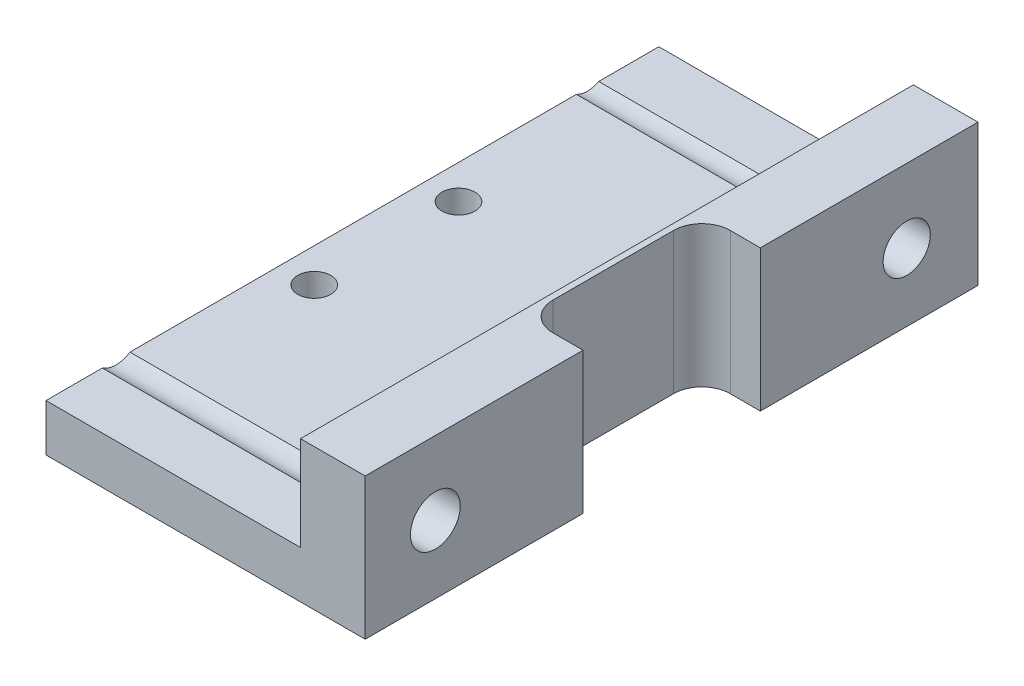
ISO-10303-21;
HEADER;
FILE_DESCRIPTION(('STEP AP214'),'2;1');
FILE_NAME('part.step','',(''),(''),'','','');
FILE_SCHEMA(('AUTOMOTIVE_DESIGN { 1 0 10303 214 1 1 1 1 }'));
ENDSEC;
DATA;
#1=APPLICATION_CONTEXT('core data for automotive mechanical design processes');
#2=APPLICATION_PROTOCOL_DEFINITION('international standard','automotive_design',2000,#1);
#3=PRODUCT_CONTEXT('',#1,'mechanical');
#4=PRODUCT('Part','Part','',(#3));
#5=PRODUCT_RELATED_PRODUCT_CATEGORY('part','',(#4));
#6=PRODUCT_DEFINITION_FORMATION('','',#4);
#7=PRODUCT_DEFINITION_CONTEXT('part definition',#1,'design');
#8=PRODUCT_DEFINITION('design','',#6,#7);
#9=PRODUCT_DEFINITION_SHAPE('','',#8);
#10=(LENGTH_UNIT() NAMED_UNIT(*) SI_UNIT(.MILLI.,.METRE.));
#11=(NAMED_UNIT(*) PLANE_ANGLE_UNIT() SI_UNIT($,.RADIAN.));
#12=(NAMED_UNIT(*) SI_UNIT($,.STERADIAN.) SOLID_ANGLE_UNIT());
#13=UNCERTAINTY_MEASURE_WITH_UNIT(LENGTH_MEASURE(1.E-05),#10,'distance_accuracy_value','');
#14=(GEOMETRIC_REPRESENTATION_CONTEXT(3) GLOBAL_UNCERTAINTY_ASSIGNED_CONTEXT((#13)) GLOBAL_UNIT_ASSIGNED_CONTEXT((#10,
#11,#12)) REPRESENTATION_CONTEXT('',''));
#15=CARTESIAN_POINT('',(0.,0.,0.));
#16=DIRECTION('',(0.,0.,1.));
#17=DIRECTION('',(1.,0.,0.));
#18=AXIS2_PLACEMENT_3D('',#15,#16,#17);
#19=CARTESIAN_POINT('',(-23.1830505076395,5.,70.8669471874579));
#20=DIRECTION('',(0.,-1.,0.));
#21=DIRECTION('',(1.,0.,0.));
#22=AXIS2_PLACEMENT_3D('',#19,#20,#21);
#23=PLANE('',#22);
#24=DIRECTION('',(0.,0.,-1.));
#25=VECTOR('',#24,1.);
#26=CARTESIAN_POINT('',(-23.1830505076395,5.,70.8669471874579));
#27=LINE('',#26,#25);
#28=CARTESIAN_POINT('',(-23.1830505076395,5.,-25.758291516465));
#29=VERTEX_POINT('',#28);
#30=CARTESIAN_POINT('',(-23.1830505076395,5.,-32.1330528125422));
#31=VERTEX_POINT('',#30);
#32=EDGE_CURVE('E165',#29,#31,#27,.T.);
#33=ORIENTED_EDGE('',*,*,#32,.F.);
#34=DIRECTION('',(1.,0.,0.));
#35=VECTOR('',#34,1.);
#36=CARTESIAN_POINT('',(-23.3275172926783,5.,-25.758291516465));
#37=LINE('',#36,#35);
#38=CARTESIAN_POINT('',(3.8169494923605,5.,-25.758291516465));
#39=VERTEX_POINT('',#38);
#40=EDGE_CURVE('E282',#29,#39,#37,.T.);
#41=ORIENTED_EDGE('',*,*,#40,.T.);
#42=DIRECTION('',(0.,0.,-1.));
#43=VECTOR('',#42,1.);
#44=CARTESIAN_POINT('',(3.8169494923605,5.,70.8669471874579));
#45=LINE('',#44,#43);
#46=CARTESIAN_POINT('',(3.8169494923605,5.,-32.1330528125422));
#47=VERTEX_POINT('',#46);
#48=EDGE_CURVE('E163',#39,#47,#45,.T.);
#49=ORIENTED_EDGE('',*,*,#48,.T.);
#50=DIRECTION('',(-1.,0.,0.));
#51=VECTOR('',#50,1.);
#52=CARTESIAN_POINT('',(-23.1830505076395,5.,-32.1330528125422));
#53=LINE('',#52,#51);
#54=EDGE_CURVE('E166',#47,#31,#53,.T.);
#55=ORIENTED_EDGE('',*,*,#54,.T.);
#56=EDGE_LOOP('',(#33,#41,#49,#55));
#57=FACE_BOUND('',#56,.T.);
#58=ADVANCED_FACE('F33',(#57),#23,.F.);
#59=CARTESIAN_POINT('',(0.416949492360503,4.99999999999999,-7.28240635641317));
#60=DIRECTION('',(0.,-1.,0.));
#61=DIRECTION('',(1.,0.,0.));
#62=AXIS2_PLACEMENT_3D('',#59,#60,#61);
#63=CIRCLE('',#62,1.75);
#64=CARTESIAN_POINT('',(2.1669494923605,4.99999999999999,-7.28240635641317));
#65=VERTEX_POINT('',#64);
#66=EDGE_CURVE('E257',#65,#65,#63,.T.);
#67=ORIENTED_EDGE('',*,*,#66,.T.);
#68=EDGE_LOOP('',(#67));
#69=FACE_BOUND('',#68,.T.);
#70=CARTESIAN_POINT('',(-19.5830505076395,5.,8.01759364358684));
#71=DIRECTION('',(0.,-1.,0.));
#72=DIRECTION('',(1.,0.,0.));
#73=AXIS2_PLACEMENT_3D('',#70,#71,#72);
#74=CIRCLE('',#73,1.75);
#75=CARTESIAN_POINT('',(-17.8330505076395,5.,8.01759364358684));
#76=VERTEX_POINT('',#75);
#77=EDGE_CURVE('E254',#76,#76,#74,.F.);
#78=ORIENTED_EDGE('',*,*,#77,.F.);
#79=EDGE_LOOP('',(#78));
#80=FACE_BOUND('',#79,.T.);
#81=CARTESIAN_POINT('',(0.416949492360503,4.99999999999999,8.01759364358684));
#82=DIRECTION('',(0.,-1.,0.));
#83=DIRECTION('',(1.,0.,0.));
#84=AXIS2_PLACEMENT_3D('',#81,#82,#83);
#85=CIRCLE('',#84,1.75);
#86=CARTESIAN_POINT('',(2.1669494923605,4.99999999999999,8.01759364358684));
#87=VERTEX_POINT('',#86);
#88=EDGE_CURVE('E247',#87,#87,#85,.F.);
#89=ORIENTED_EDGE('',*,*,#88,.F.);
#90=EDGE_LOOP('',(#89));
#91=FACE_BOUND('',#90,.T.);
#92=CARTESIAN_POINT('',(-19.5830505076395,5.,-7.28240635641317));
#93=DIRECTION('',(0.,-1.,0.));
#94=DIRECTION('',(1.,0.,0.));
#95=AXIS2_PLACEMENT_3D('',#92,#93,#94);
#96=CIRCLE('',#95,1.75);
#97=CARTESIAN_POINT('',(-17.8330505076395,5.,-7.28240635641317));
#98=VERTEX_POINT('',#97);
#99=EDGE_CURVE('E250',#98,#98,#96,.T.);
#100=ORIENTED_EDGE('',*,*,#99,.T.);
#101=EDGE_LOOP('',(#100));
#102=FACE_BOUND('',#101,.T.);
#103=CARTESIAN_POINT('',(3.8169494923605,5.,23.9626303840473));
#104=VERTEX_POINT('',#103);
#105=CARTESIAN_POINT('',(3.8169494923605,5.,-23.3896578850426));
#106=VERTEX_POINT('',#105);
#107=EDGE_CURVE('E155',#104,#106,#45,.T.);
#108=ORIENTED_EDGE('',*,*,#107,.T.);
#109=DIRECTION('',(1.,0.,0.));
#110=VECTOR('',#109,1.);
#111=CARTESIAN_POINT('',(-23.3275172926783,5.,-23.3896578850426));
#112=LINE('',#111,#110);
#113=CARTESIAN_POINT('',(-23.1830505076395,5.,-23.3896578850426));
#114=VERTEX_POINT('',#113);
#115=EDGE_CURVE('E48',#106,#114,#112,.F.);
#116=ORIENTED_EDGE('',*,*,#115,.T.);
#117=CARTESIAN_POINT('',(-23.1830505076395,5.,23.9626303840473));
#118=VERTEX_POINT('',#117);
#119=EDGE_CURVE('E157',#118,#114,#27,.T.);
#120=ORIENTED_EDGE('',*,*,#119,.F.);
#121=DIRECTION('',(1.,0.,0.));
#122=VECTOR('',#121,1.);
#123=CARTESIAN_POINT('',(-23.3275172926783,5.,23.9626303840473));
#124=LINE('',#123,#122);
#125=EDGE_CURVE('E144',#118,#104,#124,.T.);
#126=ORIENTED_EDGE('',*,*,#125,.T.);
#127=EDGE_LOOP('',(#108,#116,#120,#126));
#128=FACE_BOUND('',#127,.T.);
#129=ADVANCED_FACE('F154',(#69,#80,#91,#102,#128),#23,.F.);
#130=CARTESIAN_POINT('',(7.47247735887404,0.,6.76207757796048));
#131=DIRECTION('',(0.,1.,0.));
#132=DIRECTION('',(0.,0.,1.));
#133=AXIS2_PLACEMENT_3D('',#130,#131,#132);
#134=PLANE('',#133);
#135=CARTESIAN_POINT('',(-19.5830505076395,0.,-7.28240635641317));
#136=DIRECTION('',(0.,-1.,0.));
#137=DIRECTION('',(0.,0.,-1.));
#138=AXIS2_PLACEMENT_3D('',#135,#136,#137);
#139=CIRCLE('',#138,1.75);
#140=CARTESIAN_POINT('',(-19.5830505076395,0.,-9.03240635641317));
#141=VERTEX_POINT('',#140);
#142=EDGE_CURVE('E274',#141,#141,#139,.T.);
#143=ORIENTED_EDGE('',*,*,#142,.F.);
#144=EDGE_LOOP('',(#143));
#145=FACE_BOUND('',#144,.T.);
#146=CARTESIAN_POINT('',(0.416949492360503,0.,8.01759364358684));
#147=DIRECTION('',(0.,1.,0.));
#148=DIRECTION('',(0.,0.,1.));
#149=AXIS2_PLACEMENT_3D('',#146,#147,#148);
#150=CIRCLE('',#149,1.75);
#151=CARTESIAN_POINT('',(0.416949492360503,0.,9.76759364358684));
#152=VERTEX_POINT('',#151);
#153=EDGE_CURVE('E251',#152,#152,#150,.T.);
#154=ORIENTED_EDGE('',*,*,#153,.T.);
#155=EDGE_LOOP('',(#154));
#156=FACE_BOUND('',#155,.T.);
#157=DIRECTION('',(0.,0.,1.));
#158=VECTOR('',#157,1.);
#159=CARTESIAN_POINT('',(-23.1830505076395,0.,-32.1330528125422));
#160=LINE('',#159,#158);
#161=CARTESIAN_POINT('',(-23.1830505076395,0.,-32.1330528125422));
#162=VERTEX_POINT('',#161);
#163=CARTESIAN_POINT('',(-23.1830505076395,0.,32.8682400997158));
#164=VERTEX_POINT('',#163);
#165=EDGE_CURVE('E177',#162,#164,#160,.T.);
#166=ORIENTED_EDGE('',*,*,#165,.F.);
#167=DIRECTION('',(-1.,0.,0.));
#168=VECTOR('',#167,1.);
#169=CARTESIAN_POINT('',(-23.1830505076395,0.,-32.1330528125422));
#170=LINE('',#169,#168);
#171=CARTESIAN_POINT('',(10.6724827073217,0.,-32.1330528125422));
#172=VERTEX_POINT('',#171);
#173=EDGE_CURVE('E181',#172,#162,#170,.T.);
#174=ORIENTED_EDGE('',*,*,#173,.F.);
#175=DIRECTION('',(0.,0.,-1.));
#176=VECTOR('',#175,1.);
#177=CARTESIAN_POINT('',(10.6724827073217,0.,-32.1330528125422));
#178=LINE('',#177,#176);
#179=CARTESIAN_POINT('',(10.6724827073217,0.,-9.04017307756061));
#180=VERTEX_POINT('',#179);
#181=EDGE_CURVE('E215',#180,#172,#178,.T.);
#182=ORIENTED_EDGE('',*,*,#181,.F.);
#183=DIRECTION('',(0.999994771631635,0.,0.00323368356438442));
#184=VECTOR('',#183,1.);
#185=CARTESIAN_POINT('',(7.48217840956719,0.,-9.05048956607205));
#186=LINE('',#185,#184);
#187=CARTESIAN_POINT('',(7.48217840956719,0.,-9.05048956607205));
#188=VERTEX_POINT('',#187);
#189=EDGE_CURVE('E213',#188,#180,#186,.T.);
#190=ORIENTED_EDGE('',*,*,#189,.F.);
#191=CARTESIAN_POINT('',(7.47247735887404,0.,-6.05050525117714));
#192=DIRECTION('',(0.,-1.,0.));
#193=DIRECTION('',(0.,0.,1.));
#194=AXIS2_PLACEMENT_3D('',#191,#192,#193);
#195=CIRCLE('',#194,3.);
#196=CARTESIAN_POINT('',(4.47247735887403,0.,-6.05050525117714));
#197=VERTEX_POINT('',#196);
#198=EDGE_CURVE('E211',#197,#188,#195,.T.);
#199=ORIENTED_EDGE('',*,*,#198,.F.);
#200=DIRECTION('',(0.,0.,-1.));
#201=VECTOR('',#200,1.);
#202=CARTESIAN_POINT('',(4.47247735887404,0.,6.76207757796048));
#203=LINE('',#202,#201);
#204=CARTESIAN_POINT('',(4.47247735887404,0.,6.76207757796048));
#205=VERTEX_POINT('',#204);
#206=EDGE_CURVE('E209',#205,#197,#203,.T.);
#207=ORIENTED_EDGE('',*,*,#206,.F.);
#208=CARTESIAN_POINT('',(7.47247735887404,0.,6.76207757796048));
#209=DIRECTION('',(0.,-1.,0.));
#210=DIRECTION('',(0.,0.,1.));
#211=AXIS2_PLACEMENT_3D('',#208,#209,#210);
#212=CIRCLE('',#211,3.);
#213=CARTESIAN_POINT('',(7.47247735887404,0.,9.76207757796048));
#214=VERTEX_POINT('',#213);
#215=EDGE_CURVE('E207',#214,#205,#212,.T.);
#216=ORIENTED_EDGE('',*,*,#215,.F.);
#217=DIRECTION('',(-1.,0.,0.));
#218=VECTOR('',#217,1.);
#219=CARTESIAN_POINT('',(10.6724827073217,0.,9.76207757796047));
#220=LINE('',#219,#218);
#221=CARTESIAN_POINT('',(10.6724827073217,0.,9.76207757796047));
#222=VERTEX_POINT('',#221);
#223=EDGE_CURVE('E205',#222,#214,#220,.T.);
#224=ORIENTED_EDGE('',*,*,#223,.F.);
#225=DIRECTION('',(0.,0.,-1.));
#226=VECTOR('',#225,1.);
#227=CARTESIAN_POINT('',(10.6724827073217,0.,9.76207757796047));
#228=LINE('',#227,#226);
#229=CARTESIAN_POINT('',(10.6724827073217,0.,32.8682400997158));
#230=VERTEX_POINT('',#229);
#231=EDGE_CURVE('E203',#230,#222,#228,.T.);
#232=ORIENTED_EDGE('',*,*,#231,.F.);
#233=DIRECTION('',(1.,0.,0.));
#234=VECTOR('',#233,1.);
#235=CARTESIAN_POINT('',(-23.1830505076395,0.,32.8682400997158));
#236=LINE('',#235,#234);
#237=EDGE_CURVE('E201',#164,#230,#236,.T.);
#238=ORIENTED_EDGE('',*,*,#237,.F.);
#239=EDGE_LOOP('',(#166,#174,#182,#190,#199,#207,#216,#224,#232,#238));
#240=FACE_BOUND('',#239,.T.);
#241=CARTESIAN_POINT('',(-19.5830505076395,0.,8.01759364358684));
#242=DIRECTION('',(0.,1.,0.));
#243=DIRECTION('',(0.,0.,1.));
#244=AXIS2_PLACEMENT_3D('',#241,#242,#243);
#245=CIRCLE('',#244,1.75);
#246=CARTESIAN_POINT('',(-19.5830505076395,0.,9.76759364358684));
#247=VERTEX_POINT('',#246);
#248=EDGE_CURVE('E271',#247,#247,#245,.T.);
#249=ORIENTED_EDGE('',*,*,#248,.T.);
#250=EDGE_LOOP('',(#249));
#251=FACE_BOUND('',#250,.T.);
#252=CARTESIAN_POINT('',(0.416949492360503,0.,-7.28240635641317));
#253=DIRECTION('',(0.,-1.,0.));
#254=DIRECTION('',(0.,0.,-1.));
#255=AXIS2_PLACEMENT_3D('',#252,#253,#254);
#256=CIRCLE('',#255,1.75);
#257=CARTESIAN_POINT('',(0.416949492360503,0.,-9.03240635641317));
#258=VERTEX_POINT('',#257);
#259=EDGE_CURVE('E270',#258,#258,#256,.T.);
#260=ORIENTED_EDGE('',*,*,#259,.F.);
#261=EDGE_LOOP('',(#260));
#262=FACE_BOUND('',#261,.T.);
#263=ADVANCED_FACE('F314',(#145,#156,#240,#251,#262),#134,.F.);
#264=CARTESIAN_POINT('',(3.8169494923605,5.,32.8682400997158));
#265=VERTEX_POINT('',#264);
#266=CARTESIAN_POINT('',(3.8169494923605,5.,26.8894202144451));
#267=VERTEX_POINT('',#266);
#268=EDGE_CURVE('E162',#265,#267,#45,.T.);
#269=ORIENTED_EDGE('',*,*,#268,.T.);
#270=DIRECTION('',(1.,0.,0.));
#271=VECTOR('',#270,1.);
#272=CARTESIAN_POINT('',(-23.3275172926783,5.,26.8894202144451));
#273=LINE('',#272,#271);
#274=CARTESIAN_POINT('',(-23.1830505076395,5.,26.8894202144451));
#275=VERTEX_POINT('',#274);
#276=EDGE_CURVE('E55',#267,#275,#273,.F.);
#277=ORIENTED_EDGE('',*,*,#276,.T.);
#278=CARTESIAN_POINT('',(-23.1830505076395,5.,32.8682400997158));
#279=VERTEX_POINT('',#278);
#280=EDGE_CURVE('E169',#279,#275,#27,.T.);
#281=ORIENTED_EDGE('',*,*,#280,.F.);
#282=DIRECTION('',(-1.,0.,0.));
#283=VECTOR('',#282,1.);
#284=CARTESIAN_POINT('',(-23.1830505076395,5.,32.8682400997158));
#285=LINE('',#284,#283);
#286=EDGE_CURVE('E174',#265,#279,#285,.T.);
#287=ORIENTED_EDGE('',*,*,#286,.F.);
#288=EDGE_LOOP('',(#269,#277,#281,#287));
#289=FACE_BOUND('',#288,.T.);
#290=ADVANCED_FACE('F324',(#289),#23,.F.);
#291=CARTESIAN_POINT('',(-23.1830505076395,15.,-32.1330528125422));
#292=DIRECTION('',(1.,0.,0.));
#293=DIRECTION('',(0.,0.,-1.));
#294=AXIS2_PLACEMENT_3D('',#291,#292,#293);
#295=PLANE('',#294);
#296=ORIENTED_EDGE('',*,*,#119,.T.);
#297=CARTESIAN_POINT('',(-23.1830505076395,7.20167974056713,-24.5739747007538));
#298=DIRECTION('',(1.,0.,0.));
#299=DIRECTION('',(0.,0.,-1.));
#300=AXIS2_PLACEMENT_3D('',#297,#298,#299);
#301=CIRCLE('',#300,2.5);
#302=EDGE_CURVE('E279',#114,#29,#301,.T.);
#303=ORIENTED_EDGE('',*,*,#302,.T.);
#304=ORIENTED_EDGE('',*,*,#32,.T.);
#305=DIRECTION('',(0.,-1.,0.));
#306=VECTOR('',#305,1.);
#307=CARTESIAN_POINT('',(-23.1830505076395,15.,-32.1330528125422));
#308=LINE('',#307,#306);
#309=EDGE_CURVE('E198',#31,#162,#308,.T.);
#310=ORIENTED_EDGE('',*,*,#309,.T.);
#311=ORIENTED_EDGE('',*,*,#165,.T.);
#312=DIRECTION('',(0.,-1.,0.));
#313=VECTOR('',#312,1.);
#314=CARTESIAN_POINT('',(-23.1830505076395,15.,32.8682400997158));
#315=LINE('',#314,#313);
#316=EDGE_CURVE('E244',#279,#164,#315,.T.);
#317=ORIENTED_EDGE('',*,*,#316,.F.);
#318=ORIENTED_EDGE('',*,*,#280,.T.);
#319=CARTESIAN_POINT('',(-23.1830505076395,7.20167974056695,25.4260252992462));
#320=DIRECTION('',(1.,0.,0.));
#321=DIRECTION('',(0.,0.,-1.));
#322=AXIS2_PLACEMENT_3D('',#319,#320,#321);
#323=CIRCLE('',#322,2.64365624804985);
#324=EDGE_CURVE('E158',#275,#118,#323,.T.);
#325=ORIENTED_EDGE('',*,*,#324,.T.);
#326=EDGE_LOOP('',(#296,#303,#304,#310,#311,#317,#318,#325));
#327=FACE_BOUND('',#326,.T.);
#328=ADVANCED_FACE('F35',(#327),#295,.F.);
#329=CARTESIAN_POINT('',(-23.1830505076395,15.,32.8682400997158));
#330=DIRECTION('',(0.,0.,-1.));
#331=DIRECTION('',(-1.,0.,0.));
#332=AXIS2_PLACEMENT_3D('',#329,#330,#331);
#333=PLANE('',#332);
#334=DIRECTION('',(0.,-1.,0.));
#335=VECTOR('',#334,1.);
#336=CARTESIAN_POINT('',(3.8169494923605,15.,32.8682400997158));
#337=LINE('',#336,#335);
#338=CARTESIAN_POINT('',(3.8169494923605,15.,32.8682400997158));
#339=VERTEX_POINT('',#338);
#340=EDGE_CURVE('E171',#339,#265,#337,.T.);
#341=ORIENTED_EDGE('',*,*,#340,.T.);
#342=ORIENTED_EDGE('',*,*,#286,.T.);
#343=ORIENTED_EDGE('',*,*,#316,.T.);
#344=ORIENTED_EDGE('',*,*,#237,.T.);
#345=DIRECTION('',(0.,-1.,0.));
#346=VECTOR('',#345,1.);
#347=CARTESIAN_POINT('',(10.6724827073217,15.,32.8682400997158));
#348=LINE('',#347,#346);
#349=CARTESIAN_POINT('',(10.6724827073217,15.,32.8682400997158));
#350=VERTEX_POINT('',#349);
#351=EDGE_CURVE('E241',#350,#230,#348,.T.);
#352=ORIENTED_EDGE('',*,*,#351,.F.);
#353=DIRECTION('',(1.,0.,0.));
#354=VECTOR('',#353,1.);
#355=CARTESIAN_POINT('',(-23.1830505076395,15.,32.8682400997158));
#356=LINE('',#355,#354);
#357=EDGE_CURVE('E178',#339,#350,#356,.T.);
#358=ORIENTED_EDGE('',*,*,#357,.F.);
#359=EDGE_LOOP('',(#341,#342,#343,#344,#352,#358));
#360=FACE_BOUND('',#359,.T.);
#361=ADVANCED_FACE('F326',(#360),#333,.F.);
#362=CARTESIAN_POINT('',(10.6724827073217,15.,9.76207757796047));
#363=DIRECTION('',(-1.,0.,0.));
#364=DIRECTION('',(0.,0.,1.));
#365=AXIS2_PLACEMENT_3D('',#362,#363,#364);
#366=PLANE('',#365);
#367=CARTESIAN_POINT('',(10.6724827073217,7.20167974056695,25.4260252992462));
#368=DIRECTION('',(1.,0.,0.));
#369=DIRECTION('',(0.,0.,-1.));
#370=AXIS2_PLACEMENT_3D('',#367,#368,#369);
#371=CIRCLE('',#370,2.64365624804985);
#372=CARTESIAN_POINT('',(10.6724827073217,7.20167974056695,22.7823690511964));
#373=VERTEX_POINT('',#372);
#374=EDGE_CURVE('E289',#373,#373,#371,.T.);
#375=ORIENTED_EDGE('',*,*,#374,.F.);
#376=EDGE_LOOP('',(#375));
#377=FACE_BOUND('',#376,.T.);
#378=ORIENTED_EDGE('',*,*,#231,.T.);
#379=DIRECTION('',(0.,-1.,0.));
#380=VECTOR('',#379,1.);
#381=CARTESIAN_POINT('',(10.6724827073217,15.,9.76207757796047));
#382=LINE('',#381,#380);
#383=CARTESIAN_POINT('',(10.6724827073217,15.,9.76207757796047));
#384=VERTEX_POINT('',#383);
#385=EDGE_CURVE('E238',#384,#222,#382,.T.);
#386=ORIENTED_EDGE('',*,*,#385,.F.);
#387=DIRECTION('',(0.,0.,-1.));
#388=VECTOR('',#387,1.);
#389=CARTESIAN_POINT('',(10.6724827073217,15.,9.76207757796047));
#390=LINE('',#389,#388);
#391=EDGE_CURVE('E180',#350,#384,#390,.T.);
#392=ORIENTED_EDGE('',*,*,#391,.F.);
#393=ORIENTED_EDGE('',*,*,#351,.T.);
#394=EDGE_LOOP('',(#378,#386,#392,#393));
#395=FACE_BOUND('',#394,.T.);
#396=ADVANCED_FACE('F357',(#377,#395),#366,.F.);
#397=CARTESIAN_POINT('',(10.6724827073217,15.,9.76207757796047));
#398=DIRECTION('',(0.,0.,1.));
#399=DIRECTION('',(1.,0.,0.));
#400=AXIS2_PLACEMENT_3D('',#397,#398,#399);
#401=PLANE('',#400);
#402=ORIENTED_EDGE('',*,*,#223,.T.);
#403=DIRECTION('',(0.,-1.,0.));
#404=VECTOR('',#403,1.);
#405=CARTESIAN_POINT('',(7.47247735887404,15.,9.76207757796048));
#406=LINE('',#405,#404);
#407=CARTESIAN_POINT('',(7.47247735887404,15.,9.76207757796048));
#408=VERTEX_POINT('',#407);
#409=EDGE_CURVE('E235',#408,#214,#406,.T.);
#410=ORIENTED_EDGE('',*,*,#409,.F.);
#411=DIRECTION('',(-1.,0.,0.));
#412=VECTOR('',#411,1.);
#413=CARTESIAN_POINT('',(10.6724827073217,15.,9.76207757796047));
#414=LINE('',#413,#412);
#415=EDGE_CURVE('E183',#384,#408,#414,.T.);
#416=ORIENTED_EDGE('',*,*,#415,.F.);
#417=ORIENTED_EDGE('',*,*,#385,.T.);
#418=EDGE_LOOP('',(#402,#410,#416,#417));
#419=FACE_BOUND('',#418,.T.);
#420=ADVANCED_FACE('F352',(#419),#401,.F.);
#421=CARTESIAN_POINT('',(7.47247735887404,15.,6.76207757796048));
#422=DIRECTION('',(0.,-1.,0.));
#423=DIRECTION('',(0.,0.,-1.));
#424=AXIS2_PLACEMENT_3D('',#421,#422,#423);
#425=CYLINDRICAL_SURFACE('',#424,3.);
#426=ORIENTED_EDGE('',*,*,#215,.T.);
#427=DIRECTION('',(0.,-1.,0.));
#428=VECTOR('',#427,1.);
#429=CARTESIAN_POINT('',(4.47247735887404,15.,6.76207757796048));
#430=LINE('',#429,#428);
#431=CARTESIAN_POINT('',(4.47247735887404,15.,6.76207757796048));
#432=VERTEX_POINT('',#431);
#433=EDGE_CURVE('E232',#432,#205,#430,.T.);
#434=ORIENTED_EDGE('',*,*,#433,.F.);
#435=CARTESIAN_POINT('',(7.47247735887404,15.,6.76207757796048));
#436=DIRECTION('',(0.,-1.,0.));
#437=DIRECTION('',(0.,0.,1.));
#438=AXIS2_PLACEMENT_3D('',#435,#436,#437);
#439=CIRCLE('',#438,3.);
#440=EDGE_CURVE('E185',#408,#432,#439,.T.);
#441=ORIENTED_EDGE('',*,*,#440,.F.);
#442=ORIENTED_EDGE('',*,*,#409,.T.);
#443=EDGE_LOOP('',(#426,#434,#441,#442));
#444=FACE_BOUND('',#443,.T.);
#445=ADVANCED_FACE('F348',(#444),#425,.F.);
#446=CARTESIAN_POINT('',(4.47247735887404,15.,6.76207757796048));
#447=DIRECTION('',(-1.,0.,0.));
#448=DIRECTION('',(0.,0.,1.));
#449=AXIS2_PLACEMENT_3D('',#446,#447,#448);
#450=PLANE('',#449);
#451=ORIENTED_EDGE('',*,*,#206,.T.);
#452=DIRECTION('',(0.,-1.,0.));
#453=VECTOR('',#452,1.);
#454=CARTESIAN_POINT('',(4.47247735887403,15.,-6.05050525117714));
#455=LINE('',#454,#453);
#456=CARTESIAN_POINT('',(4.47247735887403,15.,-6.05050525117714));
#457=VERTEX_POINT('',#456);
#458=EDGE_CURVE('E229',#457,#197,#455,.T.);
#459=ORIENTED_EDGE('',*,*,#458,.F.);
#460=DIRECTION('',(0.,0.,-1.));
#461=VECTOR('',#460,1.);
#462=CARTESIAN_POINT('',(4.47247735887404,15.,6.76207757796048));
#463=LINE('',#462,#461);
#464=EDGE_CURVE('E187',#432,#457,#463,.T.);
#465=ORIENTED_EDGE('',*,*,#464,.F.);
#466=ORIENTED_EDGE('',*,*,#433,.T.);
#467=EDGE_LOOP('',(#451,#459,#465,#466));
#468=FACE_BOUND('',#467,.T.);
#469=ADVANCED_FACE('F344',(#468),#450,.F.);
#470=CARTESIAN_POINT('',(7.47247735887404,15.,-6.05050525117714));
#471=DIRECTION('',(0.,-1.,0.));
#472=DIRECTION('',(0.,0.,-1.));
#473=AXIS2_PLACEMENT_3D('',#470,#471,#472);
#474=CYLINDRICAL_SURFACE('',#473,3.);
#475=ORIENTED_EDGE('',*,*,#198,.T.);
#476=DIRECTION('',(0.,-1.,0.));
#477=VECTOR('',#476,1.);
#478=CARTESIAN_POINT('',(7.48217840956719,15.,-9.05048956607205));
#479=LINE('',#478,#477);
#480=CARTESIAN_POINT('',(7.48217840956719,15.,-9.05048956607205));
#481=VERTEX_POINT('',#480);
#482=EDGE_CURVE('E226',#481,#188,#479,.T.);
#483=ORIENTED_EDGE('',*,*,#482,.F.);
#484=CARTESIAN_POINT('',(7.47247735887404,15.,-6.05050525117714));
#485=DIRECTION('',(0.,-1.,0.));
#486=DIRECTION('',(0.,0.,1.));
#487=AXIS2_PLACEMENT_3D('',#484,#485,#486);
#488=CIRCLE('',#487,3.);
#489=EDGE_CURVE('E189',#457,#481,#488,.T.);
#490=ORIENTED_EDGE('',*,*,#489,.F.);
#491=ORIENTED_EDGE('',*,*,#458,.T.);
#492=EDGE_LOOP('',(#475,#483,#490,#491));
#493=FACE_BOUND('',#492,.T.);
#494=ADVANCED_FACE('F340',(#493),#474,.F.);
#495=CARTESIAN_POINT('',(7.48217840956719,15.,-9.05048956607205));
#496=DIRECTION('',(0.00323368356438442,0.,-0.999994771631635));
#497=DIRECTION('',(-0.999994771631635,0.,-0.00323368356438442));
#498=AXIS2_PLACEMENT_3D('',#495,#496,#497);
#499=PLANE('',#498);
#500=ORIENTED_EDGE('',*,*,#189,.T.);
#501=DIRECTION('',(0.,-1.,0.));
#502=VECTOR('',#501,1.);
#503=CARTESIAN_POINT('',(10.6724827073217,15.,-9.04017307756061));
#504=LINE('',#503,#502);
#505=CARTESIAN_POINT('',(10.6724827073217,15.,-9.04017307756061));
#506=VERTEX_POINT('',#505);
#507=EDGE_CURVE('E223',#506,#180,#504,.T.);
#508=ORIENTED_EDGE('',*,*,#507,.F.);
#509=DIRECTION('',(0.999994771631635,0.,0.00323368356438442));
#510=VECTOR('',#509,1.);
#511=CARTESIAN_POINT('',(7.48217840956719,15.,-9.05048956607205));
#512=LINE('',#511,#510);
#513=EDGE_CURVE('E191',#481,#506,#512,.T.);
#514=ORIENTED_EDGE('',*,*,#513,.F.);
#515=ORIENTED_EDGE('',*,*,#482,.T.);
#516=EDGE_LOOP('',(#500,#508,#514,#515));
#517=FACE_BOUND('',#516,.T.);
#518=ADVANCED_FACE('F301',(#517),#499,.F.);
#519=CARTESIAN_POINT('',(10.6724827073217,15.,-32.1330528125422));
#520=DIRECTION('',(-1.,0.,0.));
#521=DIRECTION('',(0.,0.,1.));
#522=AXIS2_PLACEMENT_3D('',#519,#520,#521);
#523=PLANE('',#522);
#524=CARTESIAN_POINT('',(10.6724827073217,7.20167974056713,-24.5739747007538));
#525=DIRECTION('',(1.,0.,0.));
#526=DIRECTION('',(0.,0.,-1.));
#527=AXIS2_PLACEMENT_3D('',#524,#525,#526);
#528=CIRCLE('',#527,2.5);
#529=CARTESIAN_POINT('',(10.6724827073217,7.20167974056713,-27.0739747007538));
#530=VERTEX_POINT('',#529);
#531=EDGE_CURVE('E288',#530,#530,#528,.T.);
#532=ORIENTED_EDGE('',*,*,#531,.F.);
#533=EDGE_LOOP('',(#532));
#534=FACE_BOUND('',#533,.T.);
#535=ORIENTED_EDGE('',*,*,#181,.T.);
#536=DIRECTION('',(0.,-1.,0.));
#537=VECTOR('',#536,1.);
#538=CARTESIAN_POINT('',(10.6724827073217,15.,-32.1330528125422));
#539=LINE('',#538,#537);
#540=CARTESIAN_POINT('',(10.6724827073217,15.,-32.1330528125422));
#541=VERTEX_POINT('',#540);
#542=EDGE_CURVE('E220',#541,#172,#539,.T.);
#543=ORIENTED_EDGE('',*,*,#542,.F.);
#544=DIRECTION('',(0.,0.,-1.));
#545=VECTOR('',#544,1.);
#546=CARTESIAN_POINT('',(10.6724827073217,15.,-32.1330528125422));
#547=LINE('',#546,#545);
#548=EDGE_CURVE('E193',#506,#541,#547,.T.);
#549=ORIENTED_EDGE('',*,*,#548,.F.);
#550=ORIENTED_EDGE('',*,*,#507,.T.);
#551=EDGE_LOOP('',(#535,#543,#549,#550));
#552=FACE_BOUND('',#551,.T.);
#553=ADVANCED_FACE('F297',(#534,#552),#523,.F.);
#554=CARTESIAN_POINT('',(-23.1830505076395,15.,-32.1330528125422));
#555=DIRECTION('',(0.,0.,1.));
#556=DIRECTION('',(1.,0.,0.));
#557=AXIS2_PLACEMENT_3D('',#554,#555,#556);
#558=PLANE('',#557);
#559=ORIENTED_EDGE('',*,*,#309,.F.);
#560=ORIENTED_EDGE('',*,*,#54,.F.);
#561=DIRECTION('',(0.,-1.,0.));
#562=VECTOR('',#561,1.);
#563=CARTESIAN_POINT('',(3.8169494923605,15.,-32.1330528125422));
#564=LINE('',#563,#562);
#565=CARTESIAN_POINT('',(3.8169494923605,15.,-32.1330528125422));
#566=VERTEX_POINT('',#565);
#567=EDGE_CURVE('E259',#566,#47,#564,.T.);
#568=ORIENTED_EDGE('',*,*,#567,.F.);
#569=DIRECTION('',(-1.,0.,0.));
#570=VECTOR('',#569,1.);
#571=CARTESIAN_POINT('',(-23.1830505076395,15.,-32.1330528125422));
#572=LINE('',#571,#570);
#573=EDGE_CURVE('E195',#541,#566,#572,.T.);
#574=ORIENTED_EDGE('',*,*,#573,.F.);
#575=ORIENTED_EDGE('',*,*,#542,.T.);
#576=ORIENTED_EDGE('',*,*,#173,.T.);
#577=EDGE_LOOP('',(#559,#560,#568,#574,#575,#576));
#578=FACE_BOUND('',#577,.T.);
#579=ADVANCED_FACE('F300',(#578),#558,.F.);
#580=CARTESIAN_POINT('',(7.47247735887404,15.,6.76207757796048));
#581=DIRECTION('',(0.,1.,0.));
#582=DIRECTION('',(0.,0.,1.));
#583=AXIS2_PLACEMENT_3D('',#580,#581,#582);
#584=PLANE('',#583);
#585=DIRECTION('',(0.,0.,-1.));
#586=VECTOR('',#585,1.);
#587=CARTESIAN_POINT('',(3.8169494923605,15.,6.76207757796048));
#588=LINE('',#587,#586);
#589=EDGE_CURVE('E150',#339,#566,#588,.T.);
#590=ORIENTED_EDGE('',*,*,#589,.F.);
#591=ORIENTED_EDGE('',*,*,#357,.T.);
#592=ORIENTED_EDGE('',*,*,#391,.T.);
#593=ORIENTED_EDGE('',*,*,#415,.T.);
#594=ORIENTED_EDGE('',*,*,#440,.T.);
#595=ORIENTED_EDGE('',*,*,#464,.T.);
#596=ORIENTED_EDGE('',*,*,#489,.T.);
#597=ORIENTED_EDGE('',*,*,#513,.T.);
#598=ORIENTED_EDGE('',*,*,#548,.T.);
#599=ORIENTED_EDGE('',*,*,#573,.T.);
#600=EDGE_LOOP('',(#590,#591,#592,#593,#594,#595,#596,#597,#598,#599));
#601=FACE_BOUND('',#600,.T.);
#602=ADVANCED_FACE('F331',(#601),#584,.T.);
#603=CARTESIAN_POINT('',(3.8169494923605,15.,70.8669471874579));
#604=DIRECTION('',(1.,0.,0.));
#605=DIRECTION('',(0.,1.,0.));
#606=AXIS2_PLACEMENT_3D('',#603,#604,#605);
#607=PLANE('',#606);
#608=ORIENTED_EDGE('',*,*,#48,.F.);
#609=CARTESIAN_POINT('',(3.8169494923605,7.20167974056713,-24.5739747007538));
#610=DIRECTION('',(1.,0.,0.));
#611=DIRECTION('',(0.,1.,0.));
#612=AXIS2_PLACEMENT_3D('',#609,#610,#611);
#613=CIRCLE('',#612,2.5);
#614=EDGE_CURVE('E11',#39,#106,#613,.T.);
#615=ORIENTED_EDGE('',*,*,#614,.T.);
#616=ORIENTED_EDGE('',*,*,#107,.F.);
#617=CARTESIAN_POINT('',(3.8169494923605,7.20167974056695,25.4260252992462));
#618=DIRECTION('',(1.,0.,0.));
#619=DIRECTION('',(0.,1.,0.));
#620=AXIS2_PLACEMENT_3D('',#617,#618,#619);
#621=CIRCLE('',#620,2.64365624804985);
#622=EDGE_CURVE('E41',#104,#267,#621,.T.);
#623=ORIENTED_EDGE('',*,*,#622,.T.);
#624=ORIENTED_EDGE('',*,*,#268,.F.);
#625=ORIENTED_EDGE('',*,*,#340,.F.);
#626=ORIENTED_EDGE('',*,*,#589,.T.);
#627=ORIENTED_EDGE('',*,*,#567,.T.);
#628=EDGE_LOOP('',(#608,#615,#616,#623,#624,#625,#626,#627));
#629=FACE_BOUND('',#628,.T.);
#630=ADVANCED_FACE('F161',(#629),#607,.F.);
#631=CARTESIAN_POINT('',(0.416949492360503,25.85,8.01759364358684));
#632=DIRECTION('',(0.,-1.,0.));
#633=DIRECTION('',(0.,0.,-1.));
#634=AXIS2_PLACEMENT_3D('',#631,#632,#633);
#635=CYLINDRICAL_SURFACE('',#634,1.75);
#636=ORIENTED_EDGE('',*,*,#153,.F.);
#637=EDGE_LOOP('',(#636));
#638=FACE_BOUND('',#637,.T.);
#639=ORIENTED_EDGE('',*,*,#88,.T.);
#640=EDGE_LOOP('',(#639));
#641=FACE_BOUND('',#640,.T.);
#642=ADVANCED_FACE('F432',(#638,#641),#635,.F.);
#643=CARTESIAN_POINT('',(-19.5830505076395,25.85,-7.28240635641317));
#644=DIRECTION('',(0.,-1.,0.));
#645=DIRECTION('',(0.,0.,-1.));
#646=AXIS2_PLACEMENT_3D('',#643,#644,#645);
#647=CYLINDRICAL_SURFACE('',#646,1.75);
#648=ORIENTED_EDGE('',*,*,#142,.T.);
#649=EDGE_LOOP('',(#648));
#650=FACE_BOUND('',#649,.T.);
#651=ORIENTED_EDGE('',*,*,#99,.F.);
#652=EDGE_LOOP('',(#651));
#653=FACE_BOUND('',#652,.T.);
#654=ADVANCED_FACE('F439',(#650,#653),#647,.F.);
#655=CARTESIAN_POINT('',(-19.5830505076395,25.85,8.01759364358684));
#656=DIRECTION('',(0.,-1.,0.));
#657=DIRECTION('',(0.,0.,-1.));
#658=AXIS2_PLACEMENT_3D('',#655,#656,#657);
#659=CYLINDRICAL_SURFACE('',#658,1.75);
#660=ORIENTED_EDGE('',*,*,#248,.F.);
#661=EDGE_LOOP('',(#660));
#662=FACE_BOUND('',#661,.T.);
#663=ORIENTED_EDGE('',*,*,#77,.T.);
#664=EDGE_LOOP('',(#663));
#665=FACE_BOUND('',#664,.T.);
#666=ADVANCED_FACE('F446',(#662,#665),#659,.F.);
#667=CARTESIAN_POINT('',(0.416949492360503,25.85,-7.28240635641317));
#668=DIRECTION('',(0.,-1.,0.));
#669=DIRECTION('',(0.,0.,-1.));
#670=AXIS2_PLACEMENT_3D('',#667,#668,#669);
#671=CYLINDRICAL_SURFACE('',#670,1.75);
#672=ORIENTED_EDGE('',*,*,#259,.T.);
#673=EDGE_LOOP('',(#672));
#674=FACE_BOUND('',#673,.T.);
#675=ORIENTED_EDGE('',*,*,#66,.F.);
#676=EDGE_LOOP('',(#675));
#677=FACE_BOUND('',#676,.T.);
#678=ADVANCED_FACE('F454',(#674,#677),#671,.F.);
#679=CARTESIAN_POINT('',(-23.3275172926783,7.20167974056695,25.4260252992462));
#680=DIRECTION('',(1.,0.,0.));
#681=DIRECTION('',(0.,0.,-1.));
#682=AXIS2_PLACEMENT_3D('',#679,#680,#681);
#683=CYLINDRICAL_SURFACE('',#682,2.64365624804985);
#684=ORIENTED_EDGE('',*,*,#374,.T.);
#685=EDGE_LOOP('',(#684));
#686=FACE_BOUND('',#685,.T.);
#687=ORIENTED_EDGE('',*,*,#276,.F.);
#688=ORIENTED_EDGE('',*,*,#622,.F.);
#689=ORIENTED_EDGE('',*,*,#125,.F.);
#690=ORIENTED_EDGE('',*,*,#324,.F.);
#691=EDGE_LOOP('',(#687,#688,#689,#690));
#692=FACE_BOUND('',#691,.T.);
#693=ADVANCED_FACE('F143',(#686,#692),#683,.F.);
#694=CARTESIAN_POINT('',(-23.3275172926783,7.20167974056713,-24.5739747007538));
#695=DIRECTION('',(1.,0.,0.));
#696=DIRECTION('',(0.,0.,-1.));
#697=AXIS2_PLACEMENT_3D('',#694,#695,#696);
#698=CYLINDRICAL_SURFACE('',#697,2.5);
#699=ORIENTED_EDGE('',*,*,#531,.T.);
#700=EDGE_LOOP('',(#699));
#701=FACE_BOUND('',#700,.T.);
#702=ORIENTED_EDGE('',*,*,#115,.F.);
#703=ORIENTED_EDGE('',*,*,#614,.F.);
#704=ORIENTED_EDGE('',*,*,#40,.F.);
#705=ORIENTED_EDGE('',*,*,#302,.F.);
#706=EDGE_LOOP('',(#702,#703,#704,#705));
#707=FACE_BOUND('',#706,.T.);
#708=ADVANCED_FACE('F295',(#701,#707),#698,.F.);
#709=CLOSED_SHELL('',(#58,#129,#263,#290,#328,#361,#396,#420,#445,#469,#494,#518,#553,#579,#602,
#630,#642,#654,#666,#678,#693,#708));
#710=MANIFOLD_SOLID_BREP('B2',#709);
#711=ADVANCED_BREP_SHAPE_REPRESENTATION('',(#18,#710),#14);
#712=SHAPE_DEFINITION_REPRESENTATION(#9,#711);
ENDSEC;
END-ISO-10303-21;
